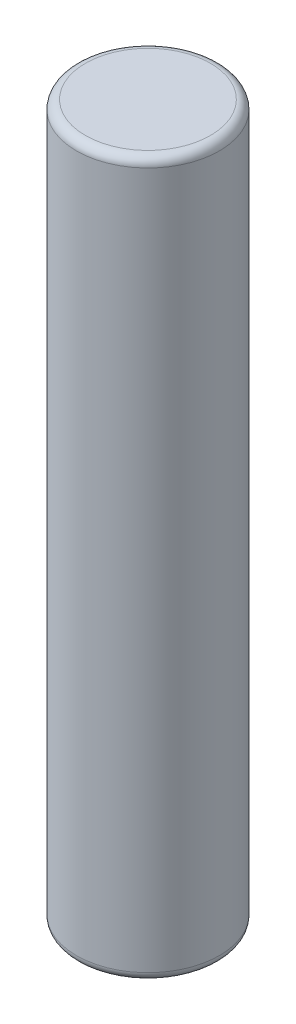
ISO-10303-21;
HEADER;
FILE_DESCRIPTION(('STEP AP214'),'2;1');
FILE_NAME('part.step','',(''),(''),'','','');
FILE_SCHEMA(('AUTOMOTIVE_DESIGN { 1 0 10303 214 1 1 1 1 }'));
ENDSEC;
DATA;
#1=APPLICATION_CONTEXT('core data for automotive mechanical design processes');
#2=APPLICATION_PROTOCOL_DEFINITION('international standard','automotive_design',2000,#1);
#3=PRODUCT_CONTEXT('',#1,'mechanical');
#4=PRODUCT('Part','Part','',(#3));
#5=PRODUCT_RELATED_PRODUCT_CATEGORY('part','',(#4));
#6=PRODUCT_DEFINITION_FORMATION('','',#4);
#7=PRODUCT_DEFINITION_CONTEXT('part definition',#1,'design');
#8=PRODUCT_DEFINITION('design','',#6,#7);
#9=PRODUCT_DEFINITION_SHAPE('','',#8);
#10=(LENGTH_UNIT() NAMED_UNIT(*) SI_UNIT(.MILLI.,.METRE.));
#11=(NAMED_UNIT(*) PLANE_ANGLE_UNIT() SI_UNIT($,.RADIAN.));
#12=(NAMED_UNIT(*) SI_UNIT($,.STERADIAN.) SOLID_ANGLE_UNIT());
#13=UNCERTAINTY_MEASURE_WITH_UNIT(LENGTH_MEASURE(1.E-05),#10,'distance_accuracy_value','');
#14=(GEOMETRIC_REPRESENTATION_CONTEXT(3) GLOBAL_UNCERTAINTY_ASSIGNED_CONTEXT((#13)) GLOBAL_UNIT_ASSIGNED_CONTEXT((#10,
#11,#12)) REPRESENTATION_CONTEXT('',''));
#15=CARTESIAN_POINT('',(0.,0.,0.));
#16=DIRECTION('',(0.,0.,1.));
#17=DIRECTION('',(1.,0.,0.));
#18=AXIS2_PLACEMENT_3D('',#15,#16,#17);
#19=CARTESIAN_POINT('',(0.,40.,0.));
#20=DIRECTION('',(0.,-1.,0.));
#21=DIRECTION('',(0.,0.,-1.));
#22=AXIS2_PLACEMENT_3D('',#19,#20,#21);
#23=CYLINDRICAL_SURFACE('',#22,4.);
#24=CARTESIAN_POINT('',(0.,0.5,0.));
#25=DIRECTION('',(0.,1.,0.));
#26=DIRECTION('',(0.,0.,1.));
#27=AXIS2_PLACEMENT_3D('',#24,#25,#26);
#28=CIRCLE('',#27,4.);
#29=CARTESIAN_POINT('',(0.,0.5,4.));
#30=VERTEX_POINT('',#29);
#31=EDGE_CURVE('E42',#30,#30,#28,.T.);
#32=ORIENTED_EDGE('',*,*,#31,.T.);
#33=EDGE_LOOP('',(#32));
#34=FACE_BOUND('',#33,.T.);
#35=CARTESIAN_POINT('',(0.,39.5,0.));
#36=DIRECTION('',(0.,1.,0.));
#37=DIRECTION('',(0.,0.,1.));
#38=AXIS2_PLACEMENT_3D('',#35,#36,#37);
#39=CIRCLE('',#38,4.);
#40=CARTESIAN_POINT('',(0.,39.5,4.));
#41=VERTEX_POINT('',#40);
#42=EDGE_CURVE('E46',#41,#41,#39,.F.);
#43=ORIENTED_EDGE('',*,*,#42,.T.);
#44=EDGE_LOOP('',(#43));
#45=FACE_BOUND('',#44,.T.);
#46=ADVANCED_FACE('F31',(#34,#45),#23,.T.);
#47=CARTESIAN_POINT('',(0.,40.,0.));
#48=DIRECTION('',(0.,1.,0.));
#49=DIRECTION('',(0.,0.,1.));
#50=AXIS2_PLACEMENT_3D('',#47,#48,#49);
#51=PLANE('',#50);
#52=CARTESIAN_POINT('',(0.,40.,0.));
#53=DIRECTION('',(0.,1.,0.));
#54=DIRECTION('',(0.,0.,1.));
#55=AXIS2_PLACEMENT_3D('',#52,#53,#54);
#56=CIRCLE('',#55,3.5);
#57=CARTESIAN_POINT('',(0.,40.,3.5));
#58=VERTEX_POINT('',#57);
#59=EDGE_CURVE('E10',#58,#58,#56,.T.);
#60=ORIENTED_EDGE('',*,*,#59,.T.);
#61=EDGE_LOOP('',(#60));
#62=FACE_BOUND('',#61,.T.);
#63=ADVANCED_FACE('F62',(#62),#51,.T.);
#64=CARTESIAN_POINT('',(0.,0.,0.));
#65=DIRECTION('',(0.,1.,0.));
#66=DIRECTION('',(0.,0.,1.));
#67=AXIS2_PLACEMENT_3D('',#64,#65,#66);
#68=PLANE('',#67);
#69=CARTESIAN_POINT('',(0.,0.,0.));
#70=DIRECTION('',(0.,1.,0.));
#71=DIRECTION('',(0.,0.,1.));
#72=AXIS2_PLACEMENT_3D('',#69,#70,#71);
#73=CIRCLE('',#72,3.5);
#74=CARTESIAN_POINT('',(0.,0.,3.5));
#75=VERTEX_POINT('',#74);
#76=EDGE_CURVE('E38',#75,#75,#73,.F.);
#77=ORIENTED_EDGE('',*,*,#76,.T.);
#78=EDGE_LOOP('',(#77));
#79=FACE_BOUND('',#78,.T.);
#80=ADVANCED_FACE('F59',(#79),#68,.F.);
#81=CARTESIAN_POINT('',(0.,0.5,0.));
#82=DIRECTION('',(0.,1.,0.));
#83=DIRECTION('',(0.,0.,1.));
#84=AXIS2_PLACEMENT_3D('',#81,#82,#83);
#85=TOROIDAL_SURFACE('',#84,3.5,0.5);
#86=ORIENTED_EDGE('',*,*,#76,.F.);
#87=EDGE_LOOP('',(#86));
#88=FACE_BOUND('',#87,.T.);
#89=ORIENTED_EDGE('',*,*,#31,.F.);
#90=EDGE_LOOP('',(#89));
#91=FACE_BOUND('',#90,.T.);
#92=ADVANCED_FACE('F55',(#88,#91),#85,.T.);
#93=CARTESIAN_POINT('',(0.,39.5,0.));
#94=DIRECTION('',(0.,1.,0.));
#95=DIRECTION('',(0.,0.,1.));
#96=AXIS2_PLACEMENT_3D('',#93,#94,#95);
#97=TOROIDAL_SURFACE('',#96,3.5,0.5);
#98=ORIENTED_EDGE('',*,*,#42,.F.);
#99=EDGE_LOOP('',(#98));
#100=FACE_BOUND('',#99,.T.);
#101=ORIENTED_EDGE('',*,*,#59,.F.);
#102=EDGE_LOOP('',(#101));
#103=FACE_BOUND('',#102,.T.);
#104=ADVANCED_FACE('F33',(#100,#103),#97,.T.);
#105=CLOSED_SHELL('',(#46,#63,#80,#92,#104));
#106=MANIFOLD_SOLID_BREP('B2',#105);
#107=ADVANCED_BREP_SHAPE_REPRESENTATION('',(#18,#106),#14);
#108=SHAPE_DEFINITION_REPRESENTATION(#9,#107);
ENDSEC;
END-ISO-10303-21;
